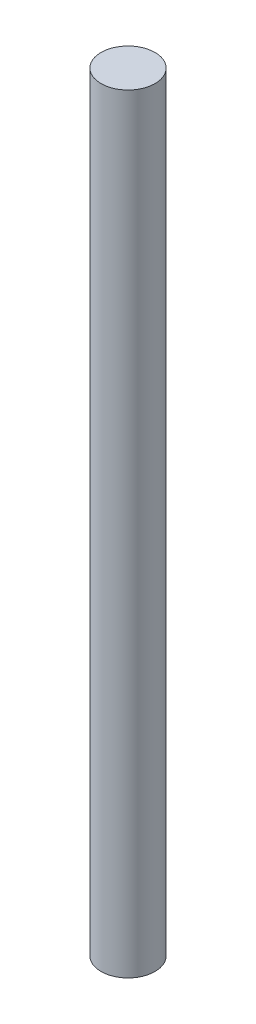
ISO-10303-21;
HEADER;
FILE_DESCRIPTION(('STEP AP214'),'2;1');
FILE_NAME('part.step','',(''),(''),'','','');
FILE_SCHEMA(('AUTOMOTIVE_DESIGN { 1 0 10303 214 1 1 1 1 }'));
ENDSEC;
DATA;
#1=APPLICATION_CONTEXT('core data for automotive mechanical design processes');
#2=APPLICATION_PROTOCOL_DEFINITION('international standard','automotive_design',2000,#1);
#3=PRODUCT_CONTEXT('',#1,'mechanical');
#4=PRODUCT('Part','Part','',(#3));
#5=PRODUCT_RELATED_PRODUCT_CATEGORY('part','',(#4));
#6=PRODUCT_DEFINITION_FORMATION('','',#4);
#7=PRODUCT_DEFINITION_CONTEXT('part definition',#1,'design');
#8=PRODUCT_DEFINITION('design','',#6,#7);
#9=PRODUCT_DEFINITION_SHAPE('','',#8);
#10=(LENGTH_UNIT() NAMED_UNIT(*) SI_UNIT(.MILLI.,.METRE.));
#11=(NAMED_UNIT(*) PLANE_ANGLE_UNIT() SI_UNIT($,.RADIAN.));
#12=(NAMED_UNIT(*) SI_UNIT($,.STERADIAN.) SOLID_ANGLE_UNIT());
#13=UNCERTAINTY_MEASURE_WITH_UNIT(LENGTH_MEASURE(1.E-05),#10,'distance_accuracy_value','');
#14=(GEOMETRIC_REPRESENTATION_CONTEXT(3) GLOBAL_UNCERTAINTY_ASSIGNED_CONTEXT((#13)) GLOBAL_UNIT_ASSIGNED_CONTEXT((#10,
#11,#12)) REPRESENTATION_CONTEXT('',''));
#15=CARTESIAN_POINT('',(0.,0.,0.));
#16=DIRECTION('',(0.,0.,1.));
#17=DIRECTION('',(1.,0.,0.));
#18=AXIS2_PLACEMENT_3D('',#15,#16,#17);
#19=CARTESIAN_POINT('',(0.,28.5,0.));
#20=DIRECTION('',(0.,-1.,0.));
#21=DIRECTION('',(0.,0.,-1.));
#22=AXIS2_PLACEMENT_3D('',#19,#20,#21);
#23=CYLINDRICAL_SURFACE('',#22,1.);
#24=CARTESIAN_POINT('',(0.,28.5,0.));
#25=DIRECTION('',(0.,1.,0.));
#26=DIRECTION('',(0.,0.,1.));
#27=AXIS2_PLACEMENT_3D('',#24,#25,#26);
#28=CIRCLE('',#27,1.);
#29=CARTESIAN_POINT('',(0.,28.5,-1.));
#30=VERTEX_POINT('',#29);
#31=EDGE_CURVE('E10',#30,#30,#28,.T.);
#32=CARTESIAN_POINT('',(0.,0.,0.));
#33=DIRECTION('',(0.,1.,0.));
#34=DIRECTION('',(0.,0.,1.));
#35=AXIS2_PLACEMENT_3D('',#32,#33,#34);
#36=CIRCLE('',#35,1.);
#37=CARTESIAN_POINT('',(0.,0.,-1.));
#38=VERTEX_POINT('',#37);
#39=EDGE_CURVE('E33',#38,#38,#36,.T.);
#40=CARTESIAN_POINT('',(0.,28.5,-1.));
#41=CARTESIAN_POINT('',(0.,28.203125,-1.));
#42=CARTESIAN_POINT('',(0.,27.90625,-1.));
#43=CARTESIAN_POINT('',(0.,27.3125,-1.));
#44=CARTESIAN_POINT('',(0.,27.015625,-1.));
#45=CARTESIAN_POINT('',(0.,26.421875,-1.));
#46=CARTESIAN_POINT('',(0.,26.125,-1.));
#47=CARTESIAN_POINT('',(0.,25.53125,-1.));
#48=CARTESIAN_POINT('',(0.,25.234375,-1.));
#49=CARTESIAN_POINT('',(0.,24.640625,-1.));
#50=CARTESIAN_POINT('',(0.,24.34375,-1.));
#51=CARTESIAN_POINT('',(0.,23.75,-1.));
#52=CARTESIAN_POINT('',(0.,23.453125,-1.));
#53=CARTESIAN_POINT('',(0.,22.859375,-1.));
#54=CARTESIAN_POINT('',(0.,22.5625,-1.));
#55=CARTESIAN_POINT('',(0.,21.96875,-1.));
#56=CARTESIAN_POINT('',(0.,21.671875,-1.));
#57=CARTESIAN_POINT('',(0.,21.078125,-1.));
#58=CARTESIAN_POINT('',(0.,20.78125,-1.));
#59=CARTESIAN_POINT('',(0.,20.1875,-1.));
#60=CARTESIAN_POINT('',(0.,19.890625,-1.));
#61=CARTESIAN_POINT('',(0.,19.296875,-1.));
#62=CARTESIAN_POINT('',(0.,19.,-1.));
#63=CARTESIAN_POINT('',(0.,18.40625,-1.));
#64=CARTESIAN_POINT('',(0.,18.109375,-1.));
#65=CARTESIAN_POINT('',(0.,17.515625,-1.));
#66=CARTESIAN_POINT('',(0.,17.21875,-1.));
#67=CARTESIAN_POINT('',(0.,16.625,-1.));
#68=CARTESIAN_POINT('',(0.,16.328125,-1.));
#69=CARTESIAN_POINT('',(0.,15.734375,-1.));
#70=CARTESIAN_POINT('',(0.,15.4375,-1.));
#71=CARTESIAN_POINT('',(0.,14.84375,-1.));
#72=CARTESIAN_POINT('',(0.,14.546875,-1.));
#73=CARTESIAN_POINT('',(0.,13.953125,-1.));
#74=CARTESIAN_POINT('',(0.,13.65625,-1.));
#75=CARTESIAN_POINT('',(0.,13.0625,-1.));
#76=CARTESIAN_POINT('',(0.,12.765625,-1.));
#77=CARTESIAN_POINT('',(0.,12.171875,-1.));
#78=CARTESIAN_POINT('',(0.,11.875,-1.));
#79=CARTESIAN_POINT('',(0.,11.28125,-1.));
#80=CARTESIAN_POINT('',(0.,10.984375,-1.));
#81=CARTESIAN_POINT('',(0.,10.390625,-1.));
#82=CARTESIAN_POINT('',(0.,10.09375,-1.));
#83=CARTESIAN_POINT('',(0.,9.5,-1.));
#84=CARTESIAN_POINT('',(0.,9.203125,-1.));
#85=CARTESIAN_POINT('',(0.,8.609375,-1.));
#86=CARTESIAN_POINT('',(0.,8.3125,-1.));
#87=CARTESIAN_POINT('',(0.,7.71875,-1.));
#88=CARTESIAN_POINT('',(0.,7.421875,-1.));
#89=CARTESIAN_POINT('',(0.,6.828125,-1.));
#90=CARTESIAN_POINT('',(0.,6.53125,-1.));
#91=CARTESIAN_POINT('',(0.,5.9375,-1.));
#92=CARTESIAN_POINT('',(0.,5.640625,-1.));
#93=CARTESIAN_POINT('',(0.,5.046875,-1.));
#94=CARTESIAN_POINT('',(0.,4.75,-1.));
#95=CARTESIAN_POINT('',(0.,4.15625,-1.));
#96=CARTESIAN_POINT('',(0.,3.859375,-1.));
#97=CARTESIAN_POINT('',(0.,3.265625,-1.));
#98=CARTESIAN_POINT('',(0.,2.96875,-1.));
#99=CARTESIAN_POINT('',(0.,2.375,-1.));
#100=CARTESIAN_POINT('',(0.,2.078125,-1.));
#101=CARTESIAN_POINT('',(0.,1.484375,-1.));
#102=CARTESIAN_POINT('',(0.,1.1875,-1.));
#103=CARTESIAN_POINT('',(0.,0.593749999999999,-1.));
#104=CARTESIAN_POINT('',(0.,0.296875,-1.));
#105=CARTESIAN_POINT('',(0.,0.,-1.));
#106=B_SPLINE_CURVE_WITH_KNOTS('',3,(#40,#41,#42,#43,#44,#45,#46,#47,#48,#49,#50,#51,#52,#53,
#54,#55,#56,#57,#58,#59,#60,#61,#62,#63,#64,#65,#66,#67,#68,#69,#70,#71,#72,#73,#74,#75,#76,#77,
#78,#79,#80,#81,#82,#83,#84,#85,#86,#87,#88,#89,#90,#91,#92,#93,#94,#95,#96,#97,#98,#99,#100,
#101,#102,#103,#104,#105),.UNSPECIFIED.,.F.,.F.,(4,2,2,2,2,2,2,2,2,2,2,2,2,2,2,2,2,2,2,2,2,2,2,
2,2,2,2,2,2,2,2,2,4),(0.,0.890624999999999,1.78125,2.671875,3.5625,4.453125,5.34375,6.234375,
7.125,8.015625,8.90625,9.796875,10.6875,11.578125,12.46875,13.359375,14.25,15.140625,16.03125,
16.921875,17.8125,18.703125,19.59375,20.484375,21.375,22.265625,23.15625,24.046875,24.9375,
25.828125,26.71875,27.609375,28.5),.UNSPECIFIED.);
#107=EDGE_CURVE('BSEAM30',#30,#38,#106,.T.);
#108=ORIENTED_EDGE('',*,*,#31,.F.);
#109=ORIENTED_EDGE('',*,*,#39,.T.);
#110=ORIENTED_EDGE('',*,*,#107,.T.);
#111=ORIENTED_EDGE('',*,*,#107,.F.);
#112=EDGE_LOOP('',(#108,#110,#109,#111));
#113=FACE_BOUND('',#112,.T.);
#114=ADVANCED_FACE('F30',(#113),#23,.T.);
#115=CARTESIAN_POINT('',(0.,28.5,0.));
#116=DIRECTION('',(0.,1.,0.));
#117=DIRECTION('',(0.,0.,1.));
#118=AXIS2_PLACEMENT_3D('',#115,#116,#117);
#119=PLANE('',#118);
#120=ORIENTED_EDGE('',*,*,#31,.T.);
#121=EDGE_LOOP('',(#120));
#122=FACE_BOUND('',#121,.T.);
#123=ADVANCED_FACE('F45',(#122),#119,.T.);
#124=CARTESIAN_POINT('',(0.,0.,0.));
#125=DIRECTION('',(0.,1.,0.));
#126=DIRECTION('',(0.,0.,1.));
#127=AXIS2_PLACEMENT_3D('',#124,#125,#126);
#128=PLANE('',#127);
#129=ORIENTED_EDGE('',*,*,#39,.F.);
#130=EDGE_LOOP('',(#129));
#131=FACE_BOUND('',#130,.T.);
#132=ADVANCED_FACE('F43',(#131),#128,.F.);
#133=CLOSED_SHELL('',(#114,#123,#132));
#134=MANIFOLD_SOLID_BREP('B2',#133);
#135=ADVANCED_BREP_SHAPE_REPRESENTATION('',(#18,#134),#14);
#136=SHAPE_DEFINITION_REPRESENTATION(#9,#135);
ENDSEC;
END-ISO-10303-21;
